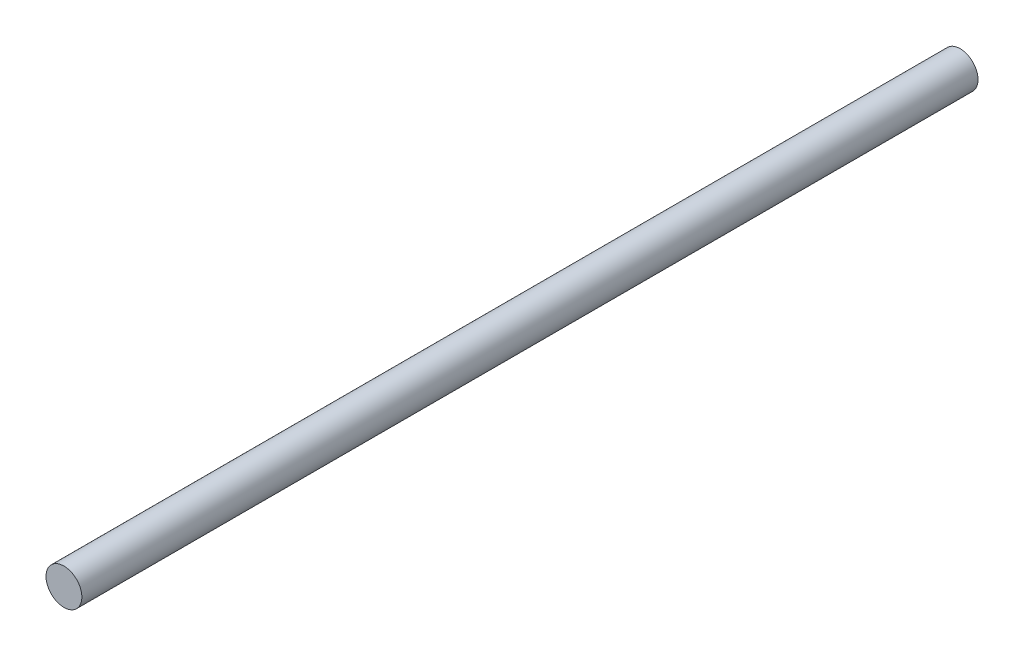
ISO-10303-21;
HEADER;
FILE_DESCRIPTION(('STEP AP214'),'2;1');
FILE_NAME('part.step','',(''),(''),'','','');
FILE_SCHEMA(('AUTOMOTIVE_DESIGN { 1 0 10303 214 1 1 1 1 }'));
ENDSEC;
DATA;
#1=APPLICATION_CONTEXT('core data for automotive mechanical design processes');
#2=APPLICATION_PROTOCOL_DEFINITION('international standard','automotive_design',2000,#1);
#3=PRODUCT_CONTEXT('',#1,'mechanical');
#4=PRODUCT('Part','Part','',(#3));
#5=PRODUCT_RELATED_PRODUCT_CATEGORY('part','',(#4));
#6=PRODUCT_DEFINITION_FORMATION('','',#4);
#7=PRODUCT_DEFINITION_CONTEXT('part definition',#1,'design');
#8=PRODUCT_DEFINITION('design','',#6,#7);
#9=PRODUCT_DEFINITION_SHAPE('','',#8);
#10=(LENGTH_UNIT() NAMED_UNIT(*) SI_UNIT(.MILLI.,.METRE.));
#11=(NAMED_UNIT(*) PLANE_ANGLE_UNIT() SI_UNIT($,.RADIAN.));
#12=(NAMED_UNIT(*) SI_UNIT($,.STERADIAN.) SOLID_ANGLE_UNIT());
#13=UNCERTAINTY_MEASURE_WITH_UNIT(LENGTH_MEASURE(1.E-05),#10,'distance_accuracy_value','');
#14=(GEOMETRIC_REPRESENTATION_CONTEXT(3) GLOBAL_UNCERTAINTY_ASSIGNED_CONTEXT((#13)) GLOBAL_UNIT_ASSIGNED_CONTEXT((#10,
#11,#12)) REPRESENTATION_CONTEXT('',''));
#15=CARTESIAN_POINT('',(0.,0.,0.));
#16=DIRECTION('',(0.,0.,1.));
#17=DIRECTION('',(1.,0.,0.));
#18=AXIS2_PLACEMENT_3D('',#15,#16,#17);
#19=CARTESIAN_POINT('',(0.,0.,1270.));
#20=DIRECTION('',(0.,0.,-1.));
#21=DIRECTION('',(-1.,0.,0.));
#22=AXIS2_PLACEMENT_3D('',#19,#20,#21);
#23=CYLINDRICAL_SURFACE('',#22,25.4);
#24=CARTESIAN_POINT('',(0.,0.,1270.));
#25=DIRECTION('',(0.,0.,1.));
#26=DIRECTION('',(1.,0.,0.));
#27=AXIS2_PLACEMENT_3D('',#24,#25,#26);
#28=CIRCLE('',#27,25.4);
#29=CARTESIAN_POINT('',(-25.4,0.,1270.));
#30=VERTEX_POINT('',#29);
#31=EDGE_CURVE('E10',#30,#30,#28,.T.);
#32=CARTESIAN_POINT('',(0.,0.,0.));
#33=DIRECTION('',(0.,0.,1.));
#34=DIRECTION('',(1.,0.,0.));
#35=AXIS2_PLACEMENT_3D('',#32,#33,#34);
#36=CIRCLE('',#35,25.4);
#37=CARTESIAN_POINT('',(-25.4,0.,-2.22044604925031E-13));
#38=VERTEX_POINT('',#37);
#39=EDGE_CURVE('E40',#38,#38,#36,.T.);
#40=CARTESIAN_POINT('',(-25.4,0.,1270.));
#41=CARTESIAN_POINT('',(-25.4,0.,1256.77083333333));
#42=CARTESIAN_POINT('',(-25.4,0.,1243.54166666667));
#43=CARTESIAN_POINT('',(-25.4,0.,1217.08333333333));
#44=CARTESIAN_POINT('',(-25.4,0.,1203.85416666667));
#45=CARTESIAN_POINT('',(-25.4,0.,1177.39583333333));
#46=CARTESIAN_POINT('',(-25.4,0.,1164.16666666667));
#47=CARTESIAN_POINT('',(-25.4,0.,1137.70833333333));
#48=CARTESIAN_POINT('',(-25.4,0.,1124.47916666667));
#49=CARTESIAN_POINT('',(-25.4,0.,1098.02083333333));
#50=CARTESIAN_POINT('',(-25.4,0.,1084.79166666667));
#51=CARTESIAN_POINT('',(-25.4,0.,1058.33333333333));
#52=CARTESIAN_POINT('',(-25.4,0.,1045.10416666667));
#53=CARTESIAN_POINT('',(-25.4,0.,1018.64583333333));
#54=CARTESIAN_POINT('',(-25.4,0.,1005.41666666667));
#55=CARTESIAN_POINT('',(-25.4,0.,978.958333333333));
#56=CARTESIAN_POINT('',(-25.4,0.,965.729166666667));
#57=CARTESIAN_POINT('',(-25.4,0.,939.270833333333));
#58=CARTESIAN_POINT('',(-25.4,0.,926.041666666667));
#59=CARTESIAN_POINT('',(-25.4,0.,899.583333333333));
#60=CARTESIAN_POINT('',(-25.4,0.,886.354166666667));
#61=CARTESIAN_POINT('',(-25.4,0.,859.895833333333));
#62=CARTESIAN_POINT('',(-25.4,0.,846.666666666667));
#63=CARTESIAN_POINT('',(-25.4,0.,820.208333333333));
#64=CARTESIAN_POINT('',(-25.4,0.,806.979166666667));
#65=CARTESIAN_POINT('',(-25.4,0.,780.520833333333));
#66=CARTESIAN_POINT('',(-25.4,0.,767.291666666667));
#67=CARTESIAN_POINT('',(-25.4,0.,740.833333333333));
#68=CARTESIAN_POINT('',(-25.4,0.,727.604166666667));
#69=CARTESIAN_POINT('',(-25.4,0.,701.145833333333));
#70=CARTESIAN_POINT('',(-25.4,0.,687.916666666667));
#71=CARTESIAN_POINT('',(-25.4,0.,661.458333333333));
#72=CARTESIAN_POINT('',(-25.4,0.,648.229166666667));
#73=CARTESIAN_POINT('',(-25.4,0.,621.770833333333));
#74=CARTESIAN_POINT('',(-25.4,0.,608.541666666667));
#75=CARTESIAN_POINT('',(-25.4,0.,582.083333333333));
#76=CARTESIAN_POINT('',(-25.4,0.,568.854166666667));
#77=CARTESIAN_POINT('',(-25.4,0.,542.395833333333));
#78=CARTESIAN_POINT('',(-25.4,0.,529.166666666667));
#79=CARTESIAN_POINT('',(-25.4,0.,502.708333333333));
#80=CARTESIAN_POINT('',(-25.4,0.,489.479166666667));
#81=CARTESIAN_POINT('',(-25.4,0.,463.020833333333));
#82=CARTESIAN_POINT('',(-25.4,0.,449.791666666667));
#83=CARTESIAN_POINT('',(-25.4,0.,423.333333333333));
#84=CARTESIAN_POINT('',(-25.4,0.,410.104166666667));
#85=CARTESIAN_POINT('',(-25.4,0.,383.645833333333));
#86=CARTESIAN_POINT('',(-25.4,0.,370.416666666667));
#87=CARTESIAN_POINT('',(-25.4,0.,343.958333333333));
#88=CARTESIAN_POINT('',(-25.4,0.,330.729166666667));
#89=CARTESIAN_POINT('',(-25.4,0.,304.270833333333));
#90=CARTESIAN_POINT('',(-25.4,0.,291.041666666666));
#91=CARTESIAN_POINT('',(-25.4,0.,264.583333333333));
#92=CARTESIAN_POINT('',(-25.4,0.,251.354166666667));
#93=CARTESIAN_POINT('',(-25.4,0.,224.895833333333));
#94=CARTESIAN_POINT('',(-25.4,0.,211.666666666667));
#95=CARTESIAN_POINT('',(-25.4,0.,185.208333333333));
#96=CARTESIAN_POINT('',(-25.4,0.,171.979166666666));
#97=CARTESIAN_POINT('',(-25.4,0.,145.520833333333));
#98=CARTESIAN_POINT('',(-25.4,0.,132.291666666666));
#99=CARTESIAN_POINT('',(-25.4,0.,105.833333333333));
#100=CARTESIAN_POINT('',(-25.4,0.,92.6041666666664));
#101=CARTESIAN_POINT('',(-25.4,0.,66.1458333333331));
#102=CARTESIAN_POINT('',(-25.4,0.,52.9166666666665));
#103=CARTESIAN_POINT('',(-25.4,0.,26.4583333333332));
#104=CARTESIAN_POINT('',(-25.4,0.,13.2291666666665));
#105=CARTESIAN_POINT('',(-25.4,0.,-2.22044604925031E-13));
#106=B_SPLINE_CURVE_WITH_KNOTS('',3,(#40,#41,#42,#43,#44,#45,#46,#47,#48,#49,#50,#51,#52,#53,
#54,#55,#56,#57,#58,#59,#60,#61,#62,#63,#64,#65,#66,#67,#68,#69,#70,#71,#72,#73,#74,#75,#76,#77,
#78,#79,#80,#81,#82,#83,#84,#85,#86,#87,#88,#89,#90,#91,#92,#93,#94,#95,#96,#97,#98,#99,#100,
#101,#102,#103,#104,#105),.UNSPECIFIED.,.F.,.F.,(4,2,2,2,2,2,2,2,2,2,2,2,2,2,2,2,2,2,2,2,2,2,2,
2,2,2,2,2,2,2,2,2,4),(0.,39.6874999999999,79.375,119.0625,158.75,198.4375,238.125,277.8125,
317.5,357.1875,396.875,436.5625,476.25,515.9375,555.625,595.3125,635.,674.6875,714.375,754.0625,
793.75,833.4375,873.125,912.8125,952.5,992.1875,1031.875,1071.5625,1111.25,1150.9375,1190.625,
1230.3125,1270.),.UNSPECIFIED.);
#107=EDGE_CURVE('BSEAM37',#30,#38,#106,.T.);
#108=ORIENTED_EDGE('',*,*,#31,.F.);
#109=ORIENTED_EDGE('',*,*,#39,.T.);
#110=ORIENTED_EDGE('',*,*,#107,.T.);
#111=ORIENTED_EDGE('',*,*,#107,.F.);
#112=EDGE_LOOP('',(#108,#110,#109,#111));
#113=FACE_BOUND('',#112,.T.);
#114=ADVANCED_FACE('F37',(#113),#23,.T.);
#115=CARTESIAN_POINT('',(0.,0.,1270.));
#116=DIRECTION('',(0.,0.,1.));
#117=DIRECTION('',(1.,0.,0.));
#118=AXIS2_PLACEMENT_3D('',#115,#116,#117);
#119=PLANE('',#118);
#120=ORIENTED_EDGE('',*,*,#31,.T.);
#121=EDGE_LOOP('',(#120));
#122=FACE_BOUND('',#121,.T.);
#123=ADVANCED_FACE('F54',(#122),#119,.T.);
#124=CARTESIAN_POINT('',(0.,0.,0.));
#125=DIRECTION('',(0.,0.,1.));
#126=DIRECTION('',(1.,0.,0.));
#127=AXIS2_PLACEMENT_3D('',#124,#125,#126);
#128=PLANE('',#127);
#129=ORIENTED_EDGE('',*,*,#39,.F.);
#130=EDGE_LOOP('',(#129));
#131=FACE_BOUND('',#130,.T.);
#132=ADVANCED_FACE('F52',(#131),#128,.F.);
#133=CLOSED_SHELL('',(#114,#123,#132));
#134=MANIFOLD_SOLID_BREP('B2',#133);
#135=ADVANCED_BREP_SHAPE_REPRESENTATION('',(#18,#134),#14);
#136=SHAPE_DEFINITION_REPRESENTATION(#9,#135);
ENDSEC;
END-ISO-10303-21;
